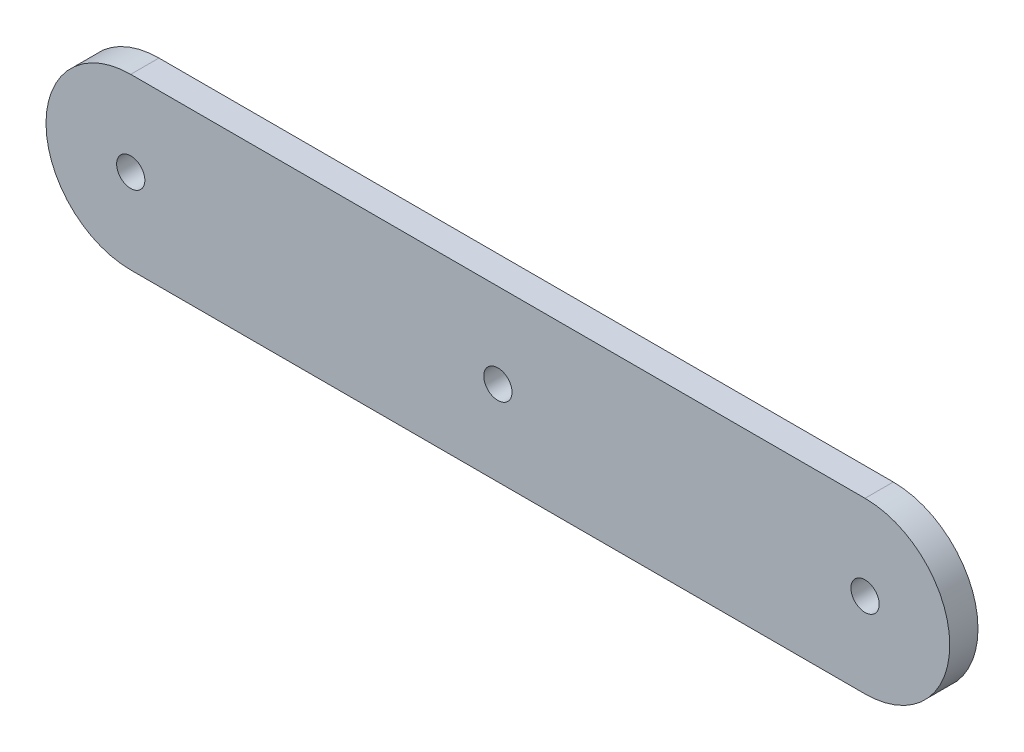
ISO-10303-21;
HEADER;
FILE_DESCRIPTION(('STEP AP214'),'2;1');
FILE_NAME('part.step','',(''),(''),'','','');
FILE_SCHEMA(('AUTOMOTIVE_DESIGN { 1 0 10303 214 1 1 1 1 }'));
ENDSEC;
DATA;
#1=APPLICATION_CONTEXT('core data for automotive mechanical design processes');
#2=APPLICATION_PROTOCOL_DEFINITION('international standard','automotive_design',2000,#1);
#3=PRODUCT_CONTEXT('',#1,'mechanical');
#4=PRODUCT('Part','Part','',(#3));
#5=PRODUCT_RELATED_PRODUCT_CATEGORY('part','',(#4));
#6=PRODUCT_DEFINITION_FORMATION('','',#4);
#7=PRODUCT_DEFINITION_CONTEXT('part definition',#1,'design');
#8=PRODUCT_DEFINITION('design','',#6,#7);
#9=PRODUCT_DEFINITION_SHAPE('','',#8);
#10=(LENGTH_UNIT() NAMED_UNIT(*) SI_UNIT(.MILLI.,.METRE.));
#11=(NAMED_UNIT(*) PLANE_ANGLE_UNIT() SI_UNIT($,.RADIAN.));
#12=(NAMED_UNIT(*) SI_UNIT($,.STERADIAN.) SOLID_ANGLE_UNIT());
#13=UNCERTAINTY_MEASURE_WITH_UNIT(LENGTH_MEASURE(1.E-05),#10,'distance_accuracy_value','');
#14=(GEOMETRIC_REPRESENTATION_CONTEXT(3) GLOBAL_UNCERTAINTY_ASSIGNED_CONTEXT((#13)) GLOBAL_UNIT_ASSIGNED_CONTEXT((#10,
#11,#12)) REPRESENTATION_CONTEXT('',''));
#15=CARTESIAN_POINT('',(0.,0.,0.));
#16=DIRECTION('',(0.,0.,1.));
#17=DIRECTION('',(1.,0.,0.));
#18=AXIS2_PLACEMENT_3D('',#15,#16,#17);
#19=CARTESIAN_POINT('',(-67.0248183116196,22.2853063382195,5.));
#20=DIRECTION('',(0.,0.,1.));
#21=DIRECTION('',(1.,0.,0.));
#22=AXIS2_PLACEMENT_3D('',#19,#20,#21);
#23=PLANE('',#22);
#24=CARTESIAN_POINT('',(-2.02481831161963,22.2853063382195,5.));
#25=DIRECTION('',(0.,0.,-1.));
#26=DIRECTION('',(-1.,0.,0.));
#27=AXIS2_PLACEMENT_3D('',#24,#25,#26);
#28=CIRCLE('',#27,2.5);
#29=CARTESIAN_POINT('',(-4.52481831161963,22.2853063382195,5.));
#30=VERTEX_POINT('',#29);
#31=EDGE_CURVE('E123',#30,#30,#28,.T.);
#32=ORIENTED_EDGE('',*,*,#31,.T.);
#33=EDGE_LOOP('',(#32));
#34=FACE_BOUND('',#33,.T.);
#35=CARTESIAN_POINT('',(-67.0248183116196,22.2853063382195,5.));
#36=DIRECTION('',(0.,0.,1.));
#37=DIRECTION('',(1.,0.,0.));
#38=AXIS2_PLACEMENT_3D('',#35,#36,#37);
#39=CIRCLE('',#38,2.5);
#40=CARTESIAN_POINT('',(-64.5248183116196,22.2853063382195,5.));
#41=VERTEX_POINT('',#40);
#42=EDGE_CURVE('E102',#41,#41,#39,.T.);
#43=ORIENTED_EDGE('',*,*,#42,.F.);
#44=EDGE_LOOP('',(#43));
#45=FACE_BOUND('',#44,.T.);
#46=CARTESIAN_POINT('',(-67.0248183116196,22.2853063382195,5.));
#47=DIRECTION('',(0.,0.,1.));
#48=DIRECTION('',(1.,0.,0.));
#49=AXIS2_PLACEMENT_3D('',#46,#47,#48);
#50=CIRCLE('',#49,15.);
#51=CARTESIAN_POINT('',(-67.0248183116196,37.2853063382195,5.));
#52=VERTEX_POINT('',#51);
#53=CARTESIAN_POINT('',(-67.0248183116196,7.28530633821953,5.));
#54=VERTEX_POINT('',#53);
#55=EDGE_CURVE('E87',#52,#54,#50,.T.);
#56=ORIENTED_EDGE('',*,*,#55,.T.);
#57=DIRECTION('',(1.,0.,0.));
#58=VECTOR('',#57,1.);
#59=CARTESIAN_POINT('',(-67.0248183116196,7.28530633821953,5.));
#60=LINE('',#59,#58);
#61=CARTESIAN_POINT('',(62.9751816883804,7.28530633821953,5.));
#62=VERTEX_POINT('',#61);
#63=EDGE_CURVE('E82',#54,#62,#60,.T.);
#64=ORIENTED_EDGE('',*,*,#63,.T.);
#65=CARTESIAN_POINT('',(62.9751816883804,22.2853063382195,5.));
#66=DIRECTION('',(0.,0.,1.));
#67=DIRECTION('',(1.,0.,0.));
#68=AXIS2_PLACEMENT_3D('',#65,#66,#67);
#69=CIRCLE('',#68,15.);
#70=CARTESIAN_POINT('',(62.9751816883804,37.2853063382195,5.));
#71=VERTEX_POINT('',#70);
#72=EDGE_CURVE('E85',#62,#71,#69,.T.);
#73=ORIENTED_EDGE('',*,*,#72,.T.);
#74=DIRECTION('',(-1.,0.,0.));
#75=VECTOR('',#74,1.);
#76=CARTESIAN_POINT('',(-67.0248183116196,37.2853063382195,5.));
#77=LINE('',#76,#75);
#78=EDGE_CURVE('E52',#71,#52,#77,.T.);
#79=ORIENTED_EDGE('',*,*,#78,.T.);
#80=EDGE_LOOP('',(#56,#64,#73,#79));
#81=FACE_BOUND('',#80,.T.);
#82=CARTESIAN_POINT('',(62.9751816883804,22.2853063382195,5.));
#83=DIRECTION('',(0.,0.,1.));
#84=DIRECTION('',(1.,0.,0.));
#85=AXIS2_PLACEMENT_3D('',#82,#83,#84);
#86=CIRCLE('',#85,2.5);
#87=CARTESIAN_POINT('',(65.4751816883804,22.2853063382195,5.));
#88=VERTEX_POINT('',#87);
#89=EDGE_CURVE('E117',#88,#88,#86,.T.);
#90=ORIENTED_EDGE('',*,*,#89,.F.);
#91=EDGE_LOOP('',(#90));
#92=FACE_BOUND('',#91,.T.);
#93=ADVANCED_FACE('F35',(#34,#45,#81,#92),#23,.T.);
#94=CARTESIAN_POINT('',(-67.0248183116196,22.2853063382195,0.));
#95=DIRECTION('',(0.,0.,1.));
#96=DIRECTION('',(1.,0.,0.));
#97=AXIS2_PLACEMENT_3D('',#94,#95,#96);
#98=PLANE('',#97);
#99=CARTESIAN_POINT('',(-2.02481831161963,22.2853063382195,0.));
#100=DIRECTION('',(0.,0.,-1.));
#101=DIRECTION('',(-1.,0.,0.));
#102=AXIS2_PLACEMENT_3D('',#99,#100,#101);
#103=CIRCLE('',#102,2.5);
#104=CARTESIAN_POINT('',(-4.52481831161963,22.2853063382195,0.));
#105=VERTEX_POINT('',#104);
#106=EDGE_CURVE('E126',#105,#105,#103,.T.);
#107=ORIENTED_EDGE('',*,*,#106,.F.);
#108=EDGE_LOOP('',(#107));
#109=FACE_BOUND('',#108,.T.);
#110=CARTESIAN_POINT('',(-67.0248183116196,22.2853063382195,0.));
#111=DIRECTION('',(0.,0.,1.));
#112=DIRECTION('',(1.,0.,0.));
#113=AXIS2_PLACEMENT_3D('',#110,#111,#112);
#114=CIRCLE('',#113,2.5);
#115=CARTESIAN_POINT('',(-64.5248183116196,22.2853063382195,0.));
#116=VERTEX_POINT('',#115);
#117=EDGE_CURVE('E114',#116,#116,#114,.T.);
#118=ORIENTED_EDGE('',*,*,#117,.T.);
#119=EDGE_LOOP('',(#118));
#120=FACE_BOUND('',#119,.T.);
#121=CARTESIAN_POINT('',(-67.0248183116196,22.2853063382195,0.));
#122=DIRECTION('',(0.,0.,1.));
#123=DIRECTION('',(1.,0.,0.));
#124=AXIS2_PLACEMENT_3D('',#121,#122,#123);
#125=CIRCLE('',#124,15.);
#126=CARTESIAN_POINT('',(-67.0248183116196,37.2853063382195,0.));
#127=VERTEX_POINT('',#126);
#128=CARTESIAN_POINT('',(-67.0248183116196,7.28530633821953,0.));
#129=VERTEX_POINT('',#128);
#130=EDGE_CURVE('E99',#127,#129,#125,.T.);
#131=ORIENTED_EDGE('',*,*,#130,.F.);
#132=DIRECTION('',(-1.,0.,0.));
#133=VECTOR('',#132,1.);
#134=CARTESIAN_POINT('',(-67.0248183116196,37.2853063382195,0.));
#135=LINE('',#134,#133);
#136=CARTESIAN_POINT('',(62.9751816883804,37.2853063382195,0.));
#137=VERTEX_POINT('',#136);
#138=EDGE_CURVE('E75',#137,#127,#135,.T.);
#139=ORIENTED_EDGE('',*,*,#138,.F.);
#140=CARTESIAN_POINT('',(62.9751816883804,22.2853063382195,0.));
#141=DIRECTION('',(0.,0.,1.));
#142=DIRECTION('',(1.,0.,0.));
#143=AXIS2_PLACEMENT_3D('',#140,#141,#142);
#144=CIRCLE('',#143,15.);
#145=CARTESIAN_POINT('',(62.9751816883804,7.28530633821953,0.));
#146=VERTEX_POINT('',#145);
#147=EDGE_CURVE('E69',#146,#137,#144,.T.);
#148=ORIENTED_EDGE('',*,*,#147,.F.);
#149=DIRECTION('',(1.,0.,0.));
#150=VECTOR('',#149,1.);
#151=CARTESIAN_POINT('',(-67.0248183116196,7.28530633821953,0.));
#152=LINE('',#151,#150);
#153=EDGE_CURVE('E91',#129,#146,#152,.T.);
#154=ORIENTED_EDGE('',*,*,#153,.F.);
#155=EDGE_LOOP('',(#131,#139,#148,#154));
#156=FACE_BOUND('',#155,.T.);
#157=CARTESIAN_POINT('',(62.9751816883804,22.2853063382195,0.));
#158=DIRECTION('',(0.,0.,1.));
#159=DIRECTION('',(1.,0.,0.));
#160=AXIS2_PLACEMENT_3D('',#157,#158,#159);
#161=CIRCLE('',#160,2.5);
#162=CARTESIAN_POINT('',(65.4751816883804,22.2853063382195,0.));
#163=VERTEX_POINT('',#162);
#164=EDGE_CURVE('E120',#163,#163,#161,.T.);
#165=ORIENTED_EDGE('',*,*,#164,.T.);
#166=EDGE_LOOP('',(#165));
#167=FACE_BOUND('',#166,.T.);
#168=ADVANCED_FACE('F110',(#109,#120,#156,#167),#98,.F.);
#169=CARTESIAN_POINT('',(-67.0248183116196,22.2853063382195,5.));
#170=DIRECTION('',(0.,0.,-1.));
#171=DIRECTION('',(-1.,0.,0.));
#172=AXIS2_PLACEMENT_3D('',#169,#170,#171);
#173=CYLINDRICAL_SURFACE('',#172,15.);
#174=ORIENTED_EDGE('',*,*,#130,.T.);
#175=DIRECTION('',(0.,0.,-1.));
#176=VECTOR('',#175,1.);
#177=CARTESIAN_POINT('',(-67.0248183116196,7.28530633821953,5.));
#178=LINE('',#177,#176);
#179=EDGE_CURVE('E11',#54,#129,#178,.T.);
#180=ORIENTED_EDGE('',*,*,#179,.F.);
#181=ORIENTED_EDGE('',*,*,#55,.F.);
#182=DIRECTION('',(0.,0.,-1.));
#183=VECTOR('',#182,1.);
#184=CARTESIAN_POINT('',(-67.0248183116196,37.2853063382195,5.));
#185=LINE('',#184,#183);
#186=EDGE_CURVE('E95',#52,#127,#185,.T.);
#187=ORIENTED_EDGE('',*,*,#186,.T.);
#188=EDGE_LOOP('',(#174,#180,#181,#187));
#189=FACE_BOUND('',#188,.T.);
#190=ADVANCED_FACE('F37',(#189),#173,.T.);
#191=CARTESIAN_POINT('',(-67.0248183116196,7.28530633821953,5.));
#192=DIRECTION('',(0.,1.,0.));
#193=DIRECTION('',(0.,0.,1.));
#194=AXIS2_PLACEMENT_3D('',#191,#192,#193);
#195=PLANE('',#194);
#196=ORIENTED_EDGE('',*,*,#153,.T.);
#197=DIRECTION('',(0.,0.,-1.));
#198=VECTOR('',#197,1.);
#199=CARTESIAN_POINT('',(62.9751816883804,7.28530633821953,5.));
#200=LINE('',#199,#198);
#201=EDGE_CURVE('E44',#62,#146,#200,.T.);
#202=ORIENTED_EDGE('',*,*,#201,.F.);
#203=ORIENTED_EDGE('',*,*,#63,.F.);
#204=ORIENTED_EDGE('',*,*,#179,.T.);
#205=EDGE_LOOP('',(#196,#202,#203,#204));
#206=FACE_BOUND('',#205,.T.);
#207=ADVANCED_FACE('F90',(#206),#195,.F.);
#208=CARTESIAN_POINT('',(62.9751816883804,22.2853063382195,5.));
#209=DIRECTION('',(0.,0.,-1.));
#210=DIRECTION('',(-1.,0.,0.));
#211=AXIS2_PLACEMENT_3D('',#208,#209,#210);
#212=CYLINDRICAL_SURFACE('',#211,15.);
#213=ORIENTED_EDGE('',*,*,#147,.T.);
#214=DIRECTION('',(0.,0.,-1.));
#215=VECTOR('',#214,1.);
#216=CARTESIAN_POINT('',(62.9751816883804,37.2853063382195,5.));
#217=LINE('',#216,#215);
#218=EDGE_CURVE('E92',#71,#137,#217,.T.);
#219=ORIENTED_EDGE('',*,*,#218,.F.);
#220=ORIENTED_EDGE('',*,*,#72,.F.);
#221=ORIENTED_EDGE('',*,*,#201,.T.);
#222=EDGE_LOOP('',(#213,#219,#220,#221));
#223=FACE_BOUND('',#222,.T.);
#224=ADVANCED_FACE('F93',(#223),#212,.T.);
#225=CARTESIAN_POINT('',(-67.0248183116196,37.2853063382195,5.));
#226=DIRECTION('',(0.,-1.,0.));
#227=DIRECTION('',(0.,0.,-1.));
#228=AXIS2_PLACEMENT_3D('',#225,#226,#227);
#229=PLANE('',#228);
#230=ORIENTED_EDGE('',*,*,#138,.T.);
#231=ORIENTED_EDGE('',*,*,#186,.F.);
#232=ORIENTED_EDGE('',*,*,#78,.F.);
#233=ORIENTED_EDGE('',*,*,#218,.T.);
#234=EDGE_LOOP('',(#230,#231,#232,#233));
#235=FACE_BOUND('',#234,.T.);
#236=ADVANCED_FACE('F107',(#235),#229,.F.);
#237=CARTESIAN_POINT('',(-67.0248183116196,22.2853063382195,5.));
#238=DIRECTION('',(0.,0.,-1.));
#239=DIRECTION('',(-1.,0.,0.));
#240=AXIS2_PLACEMENT_3D('',#237,#238,#239);
#241=CYLINDRICAL_SURFACE('',#240,2.5);
#242=ORIENTED_EDGE('',*,*,#42,.T.);
#243=EDGE_LOOP('',(#242));
#244=FACE_BOUND('',#243,.T.);
#245=ORIENTED_EDGE('',*,*,#117,.F.);
#246=EDGE_LOOP('',(#245));
#247=FACE_BOUND('',#246,.T.);
#248=ADVANCED_FACE('F146',(#244,#247),#241,.F.);
#249=CARTESIAN_POINT('',(62.9751816883804,22.2853063382195,5.));
#250=DIRECTION('',(0.,0.,-1.));
#251=DIRECTION('',(-1.,0.,0.));
#252=AXIS2_PLACEMENT_3D('',#249,#250,#251);
#253=CYLINDRICAL_SURFACE('',#252,2.5);
#254=ORIENTED_EDGE('',*,*,#89,.T.);
#255=EDGE_LOOP('',(#254));
#256=FACE_BOUND('',#255,.T.);
#257=ORIENTED_EDGE('',*,*,#164,.F.);
#258=EDGE_LOOP('',(#257));
#259=FACE_BOUND('',#258,.T.);
#260=ADVANCED_FACE('F137',(#256,#259),#253,.F.);
#261=CARTESIAN_POINT('',(-2.02481831161963,22.2853063382195,5.));
#262=DIRECTION('',(0.,0.,-1.));
#263=DIRECTION('',(-1.,0.,0.));
#264=AXIS2_PLACEMENT_3D('',#261,#262,#263);
#265=CYLINDRICAL_SURFACE('',#264,2.5);
#266=ORIENTED_EDGE('',*,*,#31,.F.);
#267=EDGE_LOOP('',(#266));
#268=FACE_BOUND('',#267,.T.);
#269=ORIENTED_EDGE('',*,*,#106,.T.);
#270=EDGE_LOOP('',(#269));
#271=FACE_BOUND('',#270,.T.);
#272=ADVANCED_FACE('F134',(#268,#271),#265,.F.);
#273=CLOSED_SHELL('',(#93,#168,#190,#207,#224,#236,#248,#260,#272));
#274=MANIFOLD_SOLID_BREP('B2',#273);
#275=ADVANCED_BREP_SHAPE_REPRESENTATION('',(#18,#274),#14);
#276=SHAPE_DEFINITION_REPRESENTATION(#9,#275);
ENDSEC;
END-ISO-10303-21;
